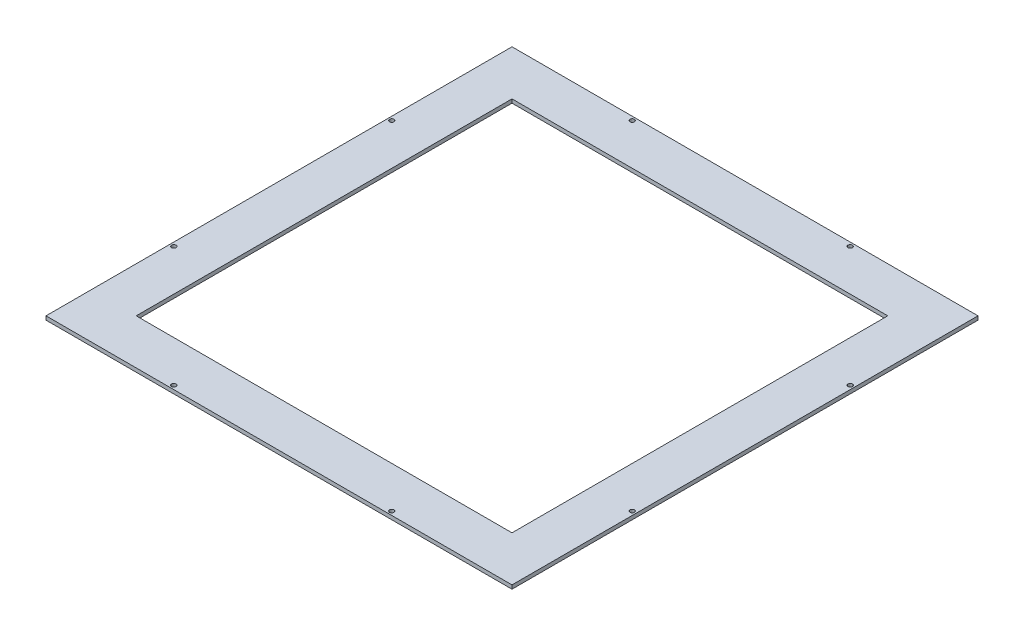
ISO-10303-21;
HEADER;
FILE_DESCRIPTION(('STEP AP214'),'2;1');
FILE_NAME('part.step','',(''),(''),'','','');
FILE_SCHEMA(('AUTOMOTIVE_DESIGN { 1 0 10303 214 1 1 1 1 }'));
ENDSEC;
DATA;
#1=APPLICATION_CONTEXT('core data for automotive mechanical design processes');
#2=APPLICATION_PROTOCOL_DEFINITION('international standard','automotive_design',2000,#1);
#3=PRODUCT_CONTEXT('',#1,'mechanical');
#4=PRODUCT('Part','Part','',(#3));
#5=PRODUCT_RELATED_PRODUCT_CATEGORY('part','',(#4));
#6=PRODUCT_DEFINITION_FORMATION('','',#4);
#7=PRODUCT_DEFINITION_CONTEXT('part definition',#1,'design');
#8=PRODUCT_DEFINITION('design','',#6,#7);
#9=PRODUCT_DEFINITION_SHAPE('','',#8);
#10=(LENGTH_UNIT() NAMED_UNIT(*) SI_UNIT(.MILLI.,.METRE.));
#11=(NAMED_UNIT(*) PLANE_ANGLE_UNIT() SI_UNIT($,.RADIAN.));
#12=(NAMED_UNIT(*) SI_UNIT($,.STERADIAN.) SOLID_ANGLE_UNIT());
#13=UNCERTAINTY_MEASURE_WITH_UNIT(LENGTH_MEASURE(1.E-05),#10,'distance_accuracy_value','');
#14=(GEOMETRIC_REPRESENTATION_CONTEXT(3) GLOBAL_UNCERTAINTY_ASSIGNED_CONTEXT((#13)) GLOBAL_UNIT_ASSIGNED_CONTEXT((#10,
#11,#12)) REPRESENTATION_CONTEXT('',''));
#15=CARTESIAN_POINT('',(0.,0.,0.));
#16=DIRECTION('',(0.,0.,1.));
#17=DIRECTION('',(1.,0.,0.));
#18=AXIS2_PLACEMENT_3D('',#15,#16,#17);
#19=CARTESIAN_POINT('',(196.85,3.175,-196.85));
#20=DIRECTION('',(-1.,0.,0.));
#21=DIRECTION('',(0.,0.,1.));
#22=AXIS2_PLACEMENT_3D('',#19,#20,#21);
#23=PLANE('',#22);
#24=DIRECTION('',(0.,0.,-1.));
#25=VECTOR('',#24,1.);
#26=CARTESIAN_POINT('',(196.85,0.,-196.85));
#27=LINE('',#26,#25);
#28=CARTESIAN_POINT('',(196.85,0.,196.85));
#29=VERTEX_POINT('',#28);
#30=CARTESIAN_POINT('',(196.85,0.,-196.85));
#31=VERTEX_POINT('',#30);
#32=EDGE_CURVE('E134',#29,#31,#27,.T.);
#33=ORIENTED_EDGE('',*,*,#32,.T.);
#34=DIRECTION('',(0.,-1.,0.));
#35=VECTOR('',#34,1.);
#36=CARTESIAN_POINT('',(196.85,3.175,-196.85));
#37=LINE('',#36,#35);
#38=CARTESIAN_POINT('',(196.85,3.175,-196.85));
#39=VERTEX_POINT('',#38);
#40=EDGE_CURVE('E11',#39,#31,#37,.T.);
#41=ORIENTED_EDGE('',*,*,#40,.F.);
#42=DIRECTION('',(0.,0.,-1.));
#43=VECTOR('',#42,1.);
#44=CARTESIAN_POINT('',(196.85,3.175,-196.85));
#45=LINE('',#44,#43);
#46=CARTESIAN_POINT('',(196.85,3.175,196.85));
#47=VERTEX_POINT('',#46);
#48=EDGE_CURVE('E138',#47,#39,#45,.T.);
#49=ORIENTED_EDGE('',*,*,#48,.F.);
#50=DIRECTION('',(0.,-1.,0.));
#51=VECTOR('',#50,1.);
#52=CARTESIAN_POINT('',(196.85,3.175,196.85));
#53=LINE('',#52,#51);
#54=EDGE_CURVE('E148',#47,#29,#53,.T.);
#55=ORIENTED_EDGE('',*,*,#54,.T.);
#56=EDGE_LOOP('',(#33,#41,#49,#55));
#57=FACE_BOUND('',#56,.T.);
#58=ADVANCED_FACE('F33',(#57),#23,.F.);
#59=CARTESIAN_POINT('',(-196.85,3.175,-196.85));
#60=DIRECTION('',(0.,0.,1.));
#61=DIRECTION('',(1.,0.,0.));
#62=AXIS2_PLACEMENT_3D('',#59,#60,#61);
#63=PLANE('',#62);
#64=DIRECTION('',(-1.,0.,0.));
#65=VECTOR('',#64,1.);
#66=CARTESIAN_POINT('',(-196.85,0.,-196.85));
#67=LINE('',#66,#65);
#68=CARTESIAN_POINT('',(-196.85,0.,-196.85));
#69=VERTEX_POINT('',#68);
#70=EDGE_CURVE('E151',#31,#69,#67,.T.);
#71=ORIENTED_EDGE('',*,*,#70,.T.);
#72=DIRECTION('',(0.,-1.,0.));
#73=VECTOR('',#72,1.);
#74=CARTESIAN_POINT('',(-196.85,3.175,-196.85));
#75=LINE('',#74,#73);
#76=CARTESIAN_POINT('',(-196.85,3.175,-196.85));
#77=VERTEX_POINT('',#76);
#78=EDGE_CURVE('E40',#77,#69,#75,.T.);
#79=ORIENTED_EDGE('',*,*,#78,.F.);
#80=DIRECTION('',(-1.,0.,0.));
#81=VECTOR('',#80,1.);
#82=CARTESIAN_POINT('',(-196.85,3.175,-196.85));
#83=LINE('',#82,#81);
#84=EDGE_CURVE('E141',#39,#77,#83,.T.);
#85=ORIENTED_EDGE('',*,*,#84,.F.);
#86=ORIENTED_EDGE('',*,*,#40,.T.);
#87=EDGE_LOOP('',(#71,#79,#85,#86));
#88=FACE_BOUND('',#87,.T.);
#89=ADVANCED_FACE('F179',(#88),#63,.F.);
#90=CARTESIAN_POINT('',(-196.85,3.175,-196.85));
#91=DIRECTION('',(1.,0.,0.));
#92=DIRECTION('',(0.,0.,-1.));
#93=AXIS2_PLACEMENT_3D('',#90,#91,#92);
#94=PLANE('',#93);
#95=DIRECTION('',(0.,0.,1.));
#96=VECTOR('',#95,1.);
#97=CARTESIAN_POINT('',(-196.85,0.,-196.85));
#98=LINE('',#97,#96);
#99=CARTESIAN_POINT('',(-196.85,0.,196.85));
#100=VERTEX_POINT('',#99);
#101=EDGE_CURVE('E153',#69,#100,#98,.T.);
#102=ORIENTED_EDGE('',*,*,#101,.T.);
#103=DIRECTION('',(0.,-1.,0.));
#104=VECTOR('',#103,1.);
#105=CARTESIAN_POINT('',(-196.85,3.175,196.85));
#106=LINE('',#105,#104);
#107=CARTESIAN_POINT('',(-196.85,3.175,196.85));
#108=VERTEX_POINT('',#107);
#109=EDGE_CURVE('E158',#108,#100,#106,.T.);
#110=ORIENTED_EDGE('',*,*,#109,.F.);
#111=DIRECTION('',(0.,0.,1.));
#112=VECTOR('',#111,1.);
#113=CARTESIAN_POINT('',(-196.85,3.175,-196.85));
#114=LINE('',#113,#112);
#115=EDGE_CURVE('E144',#77,#108,#114,.T.);
#116=ORIENTED_EDGE('',*,*,#115,.F.);
#117=ORIENTED_EDGE('',*,*,#78,.T.);
#118=EDGE_LOOP('',(#102,#110,#116,#117));
#119=FACE_BOUND('',#118,.T.);
#120=ADVANCED_FACE('F165',(#119),#94,.F.);
#121=CARTESIAN_POINT('',(-196.85,3.175,196.85));
#122=DIRECTION('',(0.,0.,-1.));
#123=DIRECTION('',(-1.,0.,0.));
#124=AXIS2_PLACEMENT_3D('',#121,#122,#123);
#125=PLANE('',#124);
#126=DIRECTION('',(1.,0.,0.));
#127=VECTOR('',#126,1.);
#128=CARTESIAN_POINT('',(-196.85,0.,196.85));
#129=LINE('',#128,#127);
#130=EDGE_CURVE('E142',#100,#29,#129,.T.);
#131=ORIENTED_EDGE('',*,*,#130,.T.);
#132=ORIENTED_EDGE('',*,*,#54,.F.);
#133=DIRECTION('',(1.,0.,0.));
#134=VECTOR('',#133,1.);
#135=CARTESIAN_POINT('',(-196.85,3.175,196.85));
#136=LINE('',#135,#134);
#137=EDGE_CURVE('E146',#108,#47,#136,.T.);
#138=ORIENTED_EDGE('',*,*,#137,.F.);
#139=ORIENTED_EDGE('',*,*,#109,.T.);
#140=EDGE_LOOP('',(#131,#132,#138,#139));
#141=FACE_BOUND('',#140,.T.);
#142=ADVANCED_FACE('F172',(#141),#125,.F.);
#143=CARTESIAN_POINT('',(0.,3.175,0.));
#144=DIRECTION('',(0.,1.,0.));
#145=DIRECTION('',(0.,0.,1.));
#146=AXIS2_PLACEMENT_3D('',#143,#144,#145);
#147=PLANE('',#146);
#148=CARTESIAN_POINT('',(-193.675,3.175,92.075));
#149=DIRECTION('',(0.,1.,0.));
#150=DIRECTION('',(0.,0.,1.));
#151=AXIS2_PLACEMENT_3D('',#148,#149,#150);
#152=CIRCLE('',#151,1.90499999999999);
#153=CARTESIAN_POINT('',(-193.675,3.175,93.98));
#154=VERTEX_POINT('',#153);
#155=EDGE_CURVE('E283',#154,#154,#152,.T.);
#156=ORIENTED_EDGE('',*,*,#155,.F.);
#157=EDGE_LOOP('',(#156));
#158=FACE_BOUND('',#157,.T.);
#159=CARTESIAN_POINT('',(-193.675,3.175,-92.075));
#160=DIRECTION('',(0.,1.,0.));
#161=DIRECTION('',(0.,0.,1.));
#162=AXIS2_PLACEMENT_3D('',#159,#160,#161);
#163=CIRCLE('',#162,1.90499999999999);
#164=CARTESIAN_POINT('',(-193.675,3.175,-90.17));
#165=VERTEX_POINT('',#164);
#166=EDGE_CURVE('E277',#165,#165,#163,.T.);
#167=ORIENTED_EDGE('',*,*,#166,.F.);
#168=EDGE_LOOP('',(#167));
#169=FACE_BOUND('',#168,.T.);
#170=CARTESIAN_POINT('',(-92.075,3.175,-193.675));
#171=DIRECTION('',(0.,1.,0.));
#172=DIRECTION('',(0.,0.,1.));
#173=AXIS2_PLACEMENT_3D('',#170,#171,#172);
#174=CIRCLE('',#173,1.90500000000002);
#175=CARTESIAN_POINT('',(-92.075,3.175,-191.77));
#176=VERTEX_POINT('',#175);
#177=EDGE_CURVE('E271',#176,#176,#174,.T.);
#178=ORIENTED_EDGE('',*,*,#177,.F.);
#179=EDGE_LOOP('',(#178));
#180=FACE_BOUND('',#179,.T.);
#181=CARTESIAN_POINT('',(92.075,3.175,-193.675));
#182=DIRECTION('',(0.,1.,0.));
#183=DIRECTION('',(0.,0.,1.));
#184=AXIS2_PLACEMENT_3D('',#181,#182,#183);
#185=CIRCLE('',#184,1.90499999999999);
#186=CARTESIAN_POINT('',(92.075,3.175,-191.77));
#187=VERTEX_POINT('',#186);
#188=EDGE_CURVE('E265',#187,#187,#185,.T.);
#189=ORIENTED_EDGE('',*,*,#188,.F.);
#190=EDGE_LOOP('',(#189));
#191=FACE_BOUND('',#190,.T.);
#192=CARTESIAN_POINT('',(193.675,3.175,-92.075));
#193=DIRECTION('',(0.,1.,0.));
#194=DIRECTION('',(0.,0.,1.));
#195=AXIS2_PLACEMENT_3D('',#192,#193,#194);
#196=CIRCLE('',#195,1.90499999999999);
#197=CARTESIAN_POINT('',(193.675,3.175,-90.17));
#198=VERTEX_POINT('',#197);
#199=EDGE_CURVE('E259',#198,#198,#196,.T.);
#200=ORIENTED_EDGE('',*,*,#199,.F.);
#201=EDGE_LOOP('',(#200));
#202=FACE_BOUND('',#201,.T.);
#203=CARTESIAN_POINT('',(193.675,3.175,92.075));
#204=DIRECTION('',(0.,1.,0.));
#205=DIRECTION('',(0.,0.,1.));
#206=AXIS2_PLACEMENT_3D('',#203,#204,#205);
#207=CIRCLE('',#206,1.90499999999999);
#208=CARTESIAN_POINT('',(193.675,3.175,93.98));
#209=VERTEX_POINT('',#208);
#210=EDGE_CURVE('E251',#209,#209,#207,.T.);
#211=ORIENTED_EDGE('',*,*,#210,.F.);
#212=EDGE_LOOP('',(#211));
#213=FACE_BOUND('',#212,.T.);
#214=CARTESIAN_POINT('',(92.0749999999999,3.175,193.675));
#215=DIRECTION('',(0.,1.,0.));
#216=DIRECTION('',(0.,0.,1.));
#217=AXIS2_PLACEMENT_3D('',#214,#215,#216);
#218=CIRCLE('',#217,1.90500000000002);
#219=CARTESIAN_POINT('',(92.0749999999999,3.175,195.58));
#220=VERTEX_POINT('',#219);
#221=EDGE_CURVE('E245',#220,#220,#218,.T.);
#222=ORIENTED_EDGE('',*,*,#221,.F.);
#223=EDGE_LOOP('',(#222));
#224=FACE_BOUND('',#223,.T.);
#225=CARTESIAN_POINT('',(-92.0750000000001,3.175,193.675));
#226=DIRECTION('',(0.,1.,0.));
#227=DIRECTION('',(0.,0.,1.));
#228=AXIS2_PLACEMENT_3D('',#225,#226,#227);
#229=CIRCLE('',#228,1.90499999999999);
#230=CARTESIAN_POINT('',(-92.0750000000001,3.175,195.58));
#231=VERTEX_POINT('',#230);
#232=EDGE_CURVE('E121',#231,#231,#229,.T.);
#233=ORIENTED_EDGE('',*,*,#232,.F.);
#234=EDGE_LOOP('',(#233));
#235=FACE_BOUND('',#234,.T.);
#236=DIRECTION('',(0.,0.,-1.));
#237=VECTOR('',#236,1.);
#238=CARTESIAN_POINT('',(158.75,3.175,158.75));
#239=LINE('',#238,#237);
#240=CARTESIAN_POINT('',(158.75,3.175,158.75));
#241=VERTEX_POINT('',#240);
#242=CARTESIAN_POINT('',(158.75,3.175,-158.75));
#243=VERTEX_POINT('',#242);
#244=EDGE_CURVE('E47',#241,#243,#239,.T.);
#245=ORIENTED_EDGE('',*,*,#244,.F.);
#246=DIRECTION('',(1.,0.,0.));
#247=VECTOR('',#246,1.);
#248=CARTESIAN_POINT('',(-158.75,3.175,158.75));
#249=LINE('',#248,#247);
#250=CARTESIAN_POINT('',(-158.75,3.175,158.75));
#251=VERTEX_POINT('',#250);
#252=EDGE_CURVE('E115',#251,#241,#249,.T.);
#253=ORIENTED_EDGE('',*,*,#252,.F.);
#254=DIRECTION('',(0.,0.,1.));
#255=VECTOR('',#254,1.);
#256=CARTESIAN_POINT('',(-158.75,3.175,158.75));
#257=LINE('',#256,#255);
#258=CARTESIAN_POINT('',(-158.75,3.175,-158.75));
#259=VERTEX_POINT('',#258);
#260=EDGE_CURVE('E118',#259,#251,#257,.T.);
#261=ORIENTED_EDGE('',*,*,#260,.F.);
#262=DIRECTION('',(-1.,0.,0.));
#263=VECTOR('',#262,1.);
#264=CARTESIAN_POINT('',(-158.75,3.175,-158.75));
#265=LINE('',#264,#263);
#266=EDGE_CURVE('E127',#243,#259,#265,.T.);
#267=ORIENTED_EDGE('',*,*,#266,.F.);
#268=EDGE_LOOP('',(#245,#253,#261,#267));
#269=FACE_BOUND('',#268,.T.);
#270=ORIENTED_EDGE('',*,*,#48,.T.);
#271=ORIENTED_EDGE('',*,*,#84,.T.);
#272=ORIENTED_EDGE('',*,*,#115,.T.);
#273=ORIENTED_EDGE('',*,*,#137,.T.);
#274=EDGE_LOOP('',(#270,#271,#272,#273));
#275=FACE_BOUND('',#274,.T.);
#276=ADVANCED_FACE('F178',(#158,#169,#180,#191,#202,#213,#224,#235,#269,#275),#147,.T.);
#277=CARTESIAN_POINT('',(0.,0.,0.));
#278=DIRECTION('',(0.,1.,0.));
#279=DIRECTION('',(0.,0.,1.));
#280=AXIS2_PLACEMENT_3D('',#277,#278,#279);
#281=PLANE('',#280);
#282=CARTESIAN_POINT('',(-193.675,0.,92.075));
#283=DIRECTION('',(0.,1.,0.));
#284=DIRECTION('',(0.,0.,1.));
#285=AXIS2_PLACEMENT_3D('',#282,#283,#284);
#286=CIRCLE('',#285,1.90499999999999);
#287=CARTESIAN_POINT('',(-193.675,0.,93.98));
#288=VERTEX_POINT('',#287);
#289=EDGE_CURVE('E280',#288,#288,#286,.T.);
#290=ORIENTED_EDGE('',*,*,#289,.T.);
#291=EDGE_LOOP('',(#290));
#292=FACE_BOUND('',#291,.T.);
#293=CARTESIAN_POINT('',(-193.675,0.,-92.075));
#294=DIRECTION('',(0.,1.,0.));
#295=DIRECTION('',(0.,0.,1.));
#296=AXIS2_PLACEMENT_3D('',#293,#294,#295);
#297=CIRCLE('',#296,1.90499999999999);
#298=CARTESIAN_POINT('',(-193.675,0.,-90.17));
#299=VERTEX_POINT('',#298);
#300=EDGE_CURVE('E274',#299,#299,#297,.T.);
#301=ORIENTED_EDGE('',*,*,#300,.T.);
#302=EDGE_LOOP('',(#301));
#303=FACE_BOUND('',#302,.T.);
#304=CARTESIAN_POINT('',(-92.075,0.,-193.675));
#305=DIRECTION('',(0.,1.,0.));
#306=DIRECTION('',(0.,0.,1.));
#307=AXIS2_PLACEMENT_3D('',#304,#305,#306);
#308=CIRCLE('',#307,1.90500000000002);
#309=CARTESIAN_POINT('',(-92.075,0.,-191.77));
#310=VERTEX_POINT('',#309);
#311=EDGE_CURVE('E268',#310,#310,#308,.T.);
#312=ORIENTED_EDGE('',*,*,#311,.T.);
#313=EDGE_LOOP('',(#312));
#314=FACE_BOUND('',#313,.T.);
#315=CARTESIAN_POINT('',(92.075,0.,-193.675));
#316=DIRECTION('',(0.,1.,0.));
#317=DIRECTION('',(0.,0.,1.));
#318=AXIS2_PLACEMENT_3D('',#315,#316,#317);
#319=CIRCLE('',#318,1.90499999999999);
#320=CARTESIAN_POINT('',(92.075,0.,-191.77));
#321=VERTEX_POINT('',#320);
#322=EDGE_CURVE('E262',#321,#321,#319,.T.);
#323=ORIENTED_EDGE('',*,*,#322,.T.);
#324=EDGE_LOOP('',(#323));
#325=FACE_BOUND('',#324,.T.);
#326=CARTESIAN_POINT('',(193.675,0.,-92.075));
#327=DIRECTION('',(0.,1.,0.));
#328=DIRECTION('',(0.,0.,1.));
#329=AXIS2_PLACEMENT_3D('',#326,#327,#328);
#330=CIRCLE('',#329,1.90499999999999);
#331=CARTESIAN_POINT('',(193.675,0.,-90.17));
#332=VERTEX_POINT('',#331);
#333=EDGE_CURVE('E256',#332,#332,#330,.T.);
#334=ORIENTED_EDGE('',*,*,#333,.T.);
#335=EDGE_LOOP('',(#334));
#336=FACE_BOUND('',#335,.T.);
#337=CARTESIAN_POINT('',(193.675,0.,92.075));
#338=DIRECTION('',(0.,1.,0.));
#339=DIRECTION('',(0.,0.,1.));
#340=AXIS2_PLACEMENT_3D('',#337,#338,#339);
#341=CIRCLE('',#340,1.90499999999999);
#342=CARTESIAN_POINT('',(193.675,0.,93.98));
#343=VERTEX_POINT('',#342);
#344=EDGE_CURVE('E247',#343,#343,#341,.T.);
#345=ORIENTED_EDGE('',*,*,#344,.T.);
#346=EDGE_LOOP('',(#345));
#347=FACE_BOUND('',#346,.T.);
#348=CARTESIAN_POINT('',(92.0749999999999,0.,193.675));
#349=DIRECTION('',(0.,1.,0.));
#350=DIRECTION('',(0.,0.,1.));
#351=AXIS2_PLACEMENT_3D('',#348,#349,#350);
#352=CIRCLE('',#351,1.90500000000002);
#353=CARTESIAN_POINT('',(92.0749999999999,0.,195.58));
#354=VERTEX_POINT('',#353);
#355=EDGE_CURVE('E242',#354,#354,#352,.T.);
#356=ORIENTED_EDGE('',*,*,#355,.T.);
#357=EDGE_LOOP('',(#356));
#358=FACE_BOUND('',#357,.T.);
#359=CARTESIAN_POINT('',(-92.0750000000001,0.,193.675));
#360=DIRECTION('',(0.,1.,0.));
#361=DIRECTION('',(0.,0.,1.));
#362=AXIS2_PLACEMENT_3D('',#359,#360,#361);
#363=CIRCLE('',#362,1.90499999999999);
#364=CARTESIAN_POINT('',(-92.0750000000001,0.,195.58));
#365=VERTEX_POINT('',#364);
#366=EDGE_CURVE('E128',#365,#365,#363,.T.);
#367=ORIENTED_EDGE('',*,*,#366,.T.);
#368=EDGE_LOOP('',(#367));
#369=FACE_BOUND('',#368,.T.);
#370=DIRECTION('',(1.,0.,0.));
#371=VECTOR('',#370,1.);
#372=CARTESIAN_POINT('',(-158.75,0.,158.75));
#373=LINE('',#372,#371);
#374=CARTESIAN_POINT('',(-158.75,0.,158.75));
#375=VERTEX_POINT('',#374);
#376=CARTESIAN_POINT('',(158.75,0.,158.75));
#377=VERTEX_POINT('',#376);
#378=EDGE_CURVE('E105',#375,#377,#373,.T.);
#379=ORIENTED_EDGE('',*,*,#378,.T.);
#380=DIRECTION('',(0.,0.,-1.));
#381=VECTOR('',#380,1.);
#382=CARTESIAN_POINT('',(158.75,0.,158.75));
#383=LINE('',#382,#381);
#384=CARTESIAN_POINT('',(158.75,0.,-158.75));
#385=VERTEX_POINT('',#384);
#386=EDGE_CURVE('E99',#377,#385,#383,.T.);
#387=ORIENTED_EDGE('',*,*,#386,.T.);
#388=DIRECTION('',(-1.,0.,0.));
#389=VECTOR('',#388,1.);
#390=CARTESIAN_POINT('',(-158.75,0.,-158.75));
#391=LINE('',#390,#389);
#392=CARTESIAN_POINT('',(-158.75,0.,-158.75));
#393=VERTEX_POINT('',#392);
#394=EDGE_CURVE('E108',#385,#393,#391,.T.);
#395=ORIENTED_EDGE('',*,*,#394,.T.);
#396=DIRECTION('',(0.,0.,1.));
#397=VECTOR('',#396,1.);
#398=CARTESIAN_POINT('',(-158.75,0.,158.75));
#399=LINE('',#398,#397);
#400=EDGE_CURVE('E55',#393,#375,#399,.T.);
#401=ORIENTED_EDGE('',*,*,#400,.T.);
#402=EDGE_LOOP('',(#379,#387,#395,#401));
#403=FACE_BOUND('',#402,.T.);
#404=ORIENTED_EDGE('',*,*,#32,.F.);
#405=ORIENTED_EDGE('',*,*,#130,.F.);
#406=ORIENTED_EDGE('',*,*,#101,.F.);
#407=ORIENTED_EDGE('',*,*,#70,.F.);
#408=EDGE_LOOP('',(#404,#405,#406,#407));
#409=FACE_BOUND('',#408,.T.);
#410=ADVANCED_FACE('F112',(#292,#303,#314,#325,#336,#347,#358,#369,#403,#409),#281,.F.);
#411=CARTESIAN_POINT('',(158.75,0.,158.75));
#412=DIRECTION('',(1.,0.,0.));
#413=DIRECTION('',(0.,0.,-1.));
#414=AXIS2_PLACEMENT_3D('',#411,#412,#413);
#415=PLANE('',#414);
#416=ORIENTED_EDGE('',*,*,#244,.T.);
#417=DIRECTION('',(0.,1.,0.));
#418=VECTOR('',#417,1.);
#419=CARTESIAN_POINT('',(158.75,0.,-158.75));
#420=LINE('',#419,#418);
#421=EDGE_CURVE('E95',#385,#243,#420,.T.);
#422=ORIENTED_EDGE('',*,*,#421,.F.);
#423=ORIENTED_EDGE('',*,*,#386,.F.);
#424=DIRECTION('',(0.,1.,0.));
#425=VECTOR('',#424,1.);
#426=CARTESIAN_POINT('',(158.75,0.,158.75));
#427=LINE('',#426,#425);
#428=EDGE_CURVE('E132',#377,#241,#427,.T.);
#429=ORIENTED_EDGE('',*,*,#428,.T.);
#430=EDGE_LOOP('',(#416,#422,#423,#429));
#431=FACE_BOUND('',#430,.T.);
#432=ADVANCED_FACE('F97',(#431),#415,.F.);
#433=CARTESIAN_POINT('',(-158.75,0.,158.75));
#434=DIRECTION('',(0.,0.,1.));
#435=DIRECTION('',(1.,0.,0.));
#436=AXIS2_PLACEMENT_3D('',#433,#434,#435);
#437=PLANE('',#436);
#438=ORIENTED_EDGE('',*,*,#252,.T.);
#439=ORIENTED_EDGE('',*,*,#428,.F.);
#440=ORIENTED_EDGE('',*,*,#378,.F.);
#441=DIRECTION('',(0.,1.,0.));
#442=VECTOR('',#441,1.);
#443=CARTESIAN_POINT('',(-158.75,0.,158.75));
#444=LINE('',#443,#442);
#445=EDGE_CURVE('E135',#375,#251,#444,.T.);
#446=ORIENTED_EDGE('',*,*,#445,.T.);
#447=EDGE_LOOP('',(#438,#439,#440,#446));
#448=FACE_BOUND('',#447,.T.);
#449=ADVANCED_FACE('F197',(#448),#437,.F.);
#450=CARTESIAN_POINT('',(-158.75,0.,158.75));
#451=DIRECTION('',(-1.,0.,0.));
#452=DIRECTION('',(0.,0.,1.));
#453=AXIS2_PLACEMENT_3D('',#450,#451,#452);
#454=PLANE('',#453);
#455=ORIENTED_EDGE('',*,*,#260,.T.);
#456=ORIENTED_EDGE('',*,*,#445,.F.);
#457=ORIENTED_EDGE('',*,*,#400,.F.);
#458=DIRECTION('',(0.,1.,0.));
#459=VECTOR('',#458,1.);
#460=CARTESIAN_POINT('',(-158.75,0.,-158.75));
#461=LINE('',#460,#459);
#462=EDGE_CURVE('E104',#393,#259,#461,.T.);
#463=ORIENTED_EDGE('',*,*,#462,.T.);
#464=EDGE_LOOP('',(#455,#456,#457,#463));
#465=FACE_BOUND('',#464,.T.);
#466=ADVANCED_FACE('F201',(#465),#454,.F.);
#467=CARTESIAN_POINT('',(-158.75,0.,-158.75));
#468=DIRECTION('',(0.,0.,-1.));
#469=DIRECTION('',(-1.,0.,0.));
#470=AXIS2_PLACEMENT_3D('',#467,#468,#469);
#471=PLANE('',#470);
#472=ORIENTED_EDGE('',*,*,#266,.T.);
#473=ORIENTED_EDGE('',*,*,#462,.F.);
#474=ORIENTED_EDGE('',*,*,#394,.F.);
#475=ORIENTED_EDGE('',*,*,#421,.T.);
#476=EDGE_LOOP('',(#472,#473,#474,#475));
#477=FACE_BOUND('',#476,.T.);
#478=ADVANCED_FACE('F109',(#477),#471,.F.);
#479=CARTESIAN_POINT('',(-92.0750000000001,0.,193.675));
#480=DIRECTION('',(0.,1.,0.));
#481=DIRECTION('',(0.,0.,1.));
#482=AXIS2_PLACEMENT_3D('',#479,#480,#481);
#483=CYLINDRICAL_SURFACE('',#482,1.90499999999999);
#484=ORIENTED_EDGE('',*,*,#366,.F.);
#485=EDGE_LOOP('',(#484));
#486=FACE_BOUND('',#485,.T.);
#487=ORIENTED_EDGE('',*,*,#232,.T.);
#488=EDGE_LOOP('',(#487));
#489=FACE_BOUND('',#488,.T.);
#490=ADVANCED_FACE('F200',(#486,#489),#483,.F.);
#491=CARTESIAN_POINT('',(92.0749999999999,0.,193.675));
#492=DIRECTION('',(0.,1.,0.));
#493=DIRECTION('',(0.,0.,1.));
#494=AXIS2_PLACEMENT_3D('',#491,#492,#493);
#495=CYLINDRICAL_SURFACE('',#494,1.90500000000002);
#496=ORIENTED_EDGE('',*,*,#355,.F.);
#497=EDGE_LOOP('',(#496));
#498=FACE_BOUND('',#497,.T.);
#499=ORIENTED_EDGE('',*,*,#221,.T.);
#500=EDGE_LOOP('',(#499));
#501=FACE_BOUND('',#500,.T.);
#502=ADVANCED_FACE('F209',(#498,#501),#495,.F.);
#503=CARTESIAN_POINT('',(193.675,0.,92.075));
#504=DIRECTION('',(0.,1.,0.));
#505=DIRECTION('',(0.,0.,1.));
#506=AXIS2_PLACEMENT_3D('',#503,#504,#505);
#507=CYLINDRICAL_SURFACE('',#506,1.90499999999999);
#508=ORIENTED_EDGE('',*,*,#344,.F.);
#509=EDGE_LOOP('',(#508));
#510=FACE_BOUND('',#509,.T.);
#511=ORIENTED_EDGE('',*,*,#210,.T.);
#512=EDGE_LOOP('',(#511));
#513=FACE_BOUND('',#512,.T.);
#514=ADVANCED_FACE('F230',(#510,#513),#507,.F.);
#515=CARTESIAN_POINT('',(193.675,0.,-92.075));
#516=DIRECTION('',(0.,1.,0.));
#517=DIRECTION('',(0.,0.,1.));
#518=AXIS2_PLACEMENT_3D('',#515,#516,#517);
#519=CYLINDRICAL_SURFACE('',#518,1.90499999999999);
#520=ORIENTED_EDGE('',*,*,#333,.F.);
#521=EDGE_LOOP('',(#520));
#522=FACE_BOUND('',#521,.T.);
#523=ORIENTED_EDGE('',*,*,#199,.T.);
#524=EDGE_LOOP('',(#523));
#525=FACE_BOUND('',#524,.T.);
#526=ADVANCED_FACE('F226',(#522,#525),#519,.F.);
#527=CARTESIAN_POINT('',(92.075,0.,-193.675));
#528=DIRECTION('',(0.,1.,0.));
#529=DIRECTION('',(0.,0.,1.));
#530=AXIS2_PLACEMENT_3D('',#527,#528,#529);
#531=CYLINDRICAL_SURFACE('',#530,1.90499999999999);
#532=ORIENTED_EDGE('',*,*,#322,.F.);
#533=EDGE_LOOP('',(#532));
#534=FACE_BOUND('',#533,.T.);
#535=ORIENTED_EDGE('',*,*,#188,.T.);
#536=EDGE_LOOP('',(#535));
#537=FACE_BOUND('',#536,.T.);
#538=ADVANCED_FACE('F222',(#534,#537),#531,.F.);
#539=CARTESIAN_POINT('',(-92.075,0.,-193.675));
#540=DIRECTION('',(0.,1.,0.));
#541=DIRECTION('',(0.,0.,1.));
#542=AXIS2_PLACEMENT_3D('',#539,#540,#541);
#543=CYLINDRICAL_SURFACE('',#542,1.90500000000002);
#544=ORIENTED_EDGE('',*,*,#311,.F.);
#545=EDGE_LOOP('',(#544));
#546=FACE_BOUND('',#545,.T.);
#547=ORIENTED_EDGE('',*,*,#177,.T.);
#548=EDGE_LOOP('',(#547));
#549=FACE_BOUND('',#548,.T.);
#550=ADVANCED_FACE('F218',(#546,#549),#543,.F.);
#551=CARTESIAN_POINT('',(-193.675,0.,-92.075));
#552=DIRECTION('',(0.,1.,0.));
#553=DIRECTION('',(0.,0.,1.));
#554=AXIS2_PLACEMENT_3D('',#551,#552,#553);
#555=CYLINDRICAL_SURFACE('',#554,1.90499999999999);
#556=ORIENTED_EDGE('',*,*,#300,.F.);
#557=EDGE_LOOP('',(#556));
#558=FACE_BOUND('',#557,.T.);
#559=ORIENTED_EDGE('',*,*,#166,.T.);
#560=EDGE_LOOP('',(#559));
#561=FACE_BOUND('',#560,.T.);
#562=ADVANCED_FACE('F214',(#558,#561),#555,.F.);
#563=CARTESIAN_POINT('',(-193.675,0.,92.075));
#564=DIRECTION('',(0.,1.,0.));
#565=DIRECTION('',(0.,0.,1.));
#566=AXIS2_PLACEMENT_3D('',#563,#564,#565);
#567=CYLINDRICAL_SURFACE('',#566,1.90499999999999);
#568=ORIENTED_EDGE('',*,*,#289,.F.);
#569=EDGE_LOOP('',(#568));
#570=FACE_BOUND('',#569,.T.);
#571=ORIENTED_EDGE('',*,*,#155,.T.);
#572=EDGE_LOOP('',(#571));
#573=FACE_BOUND('',#572,.T.);
#574=ADVANCED_FACE('F211',(#570,#573),#567,.F.);
#575=CLOSED_SHELL('',(#58,#89,#120,#142,#276,#410,#432,#449,#466,#478,#490,#502,#514,#526,#538,
#550,#562,#574));
#576=MANIFOLD_SOLID_BREP('B2',#575);
#577=ADVANCED_BREP_SHAPE_REPRESENTATION('',(#18,#576),#14);
#578=SHAPE_DEFINITION_REPRESENTATION(#9,#577);
ENDSEC;
END-ISO-10303-21;
